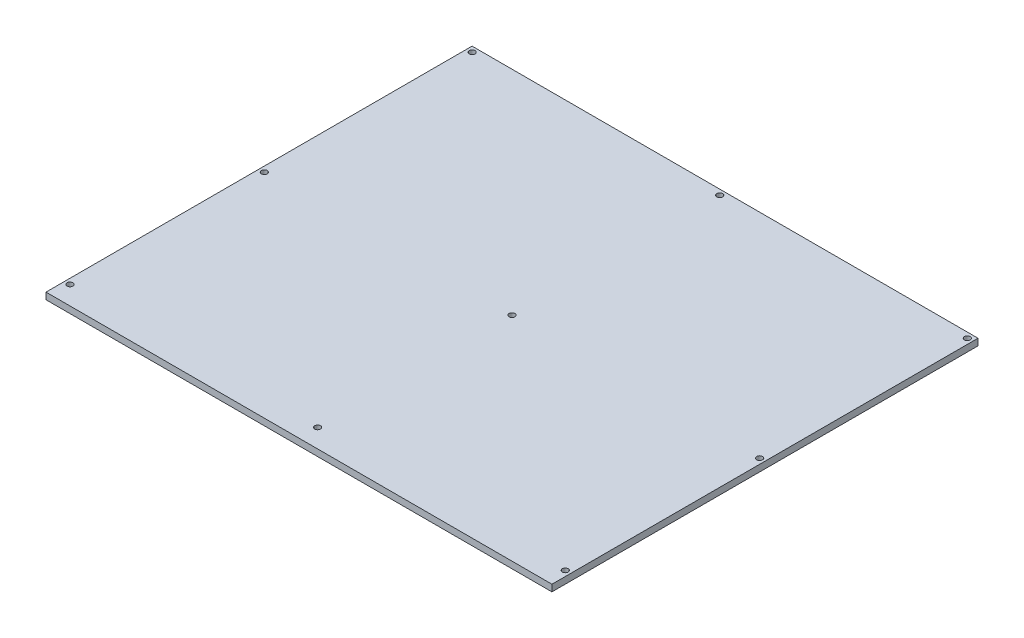
ISO-10303-21;
HEADER;
FILE_DESCRIPTION(('STEP AP214'),'2;1');
FILE_NAME('part.step','',(''),(''),'','','');
FILE_SCHEMA(('AUTOMOTIVE_DESIGN { 1 0 10303 214 1 1 1 1 }'));
ENDSEC;
DATA;
#1=APPLICATION_CONTEXT('core data for automotive mechanical design processes');
#2=APPLICATION_PROTOCOL_DEFINITION('international standard','automotive_design',2000,#1);
#3=PRODUCT_CONTEXT('',#1,'mechanical');
#4=PRODUCT('Part','Part','',(#3));
#5=PRODUCT_RELATED_PRODUCT_CATEGORY('part','',(#4));
#6=PRODUCT_DEFINITION_FORMATION('','',#4);
#7=PRODUCT_DEFINITION_CONTEXT('part definition',#1,'design');
#8=PRODUCT_DEFINITION('design','',#6,#7);
#9=PRODUCT_DEFINITION_SHAPE('','',#8);
#10=(LENGTH_UNIT() NAMED_UNIT(*) SI_UNIT(.MILLI.,.METRE.));
#11=(NAMED_UNIT(*) PLANE_ANGLE_UNIT() SI_UNIT($,.RADIAN.));
#12=(NAMED_UNIT(*) SI_UNIT($,.STERADIAN.) SOLID_ANGLE_UNIT());
#13=UNCERTAINTY_MEASURE_WITH_UNIT(LENGTH_MEASURE(1.E-05),#10,'distance_accuracy_value','');
#14=(GEOMETRIC_REPRESENTATION_CONTEXT(3) GLOBAL_UNCERTAINTY_ASSIGNED_CONTEXT((#13)) GLOBAL_UNIT_ASSIGNED_CONTEXT((#10,
#11,#12)) REPRESENTATION_CONTEXT('',''));
#15=CARTESIAN_POINT('',(0.,0.,0.));
#16=DIRECTION('',(0.,0.,1.));
#17=DIRECTION('',(1.,0.,0.));
#18=AXIS2_PLACEMENT_3D('',#15,#16,#17);
#19=CARTESIAN_POINT('',(0.,5.,0.));
#20=DIRECTION('',(1.,0.,0.));
#21=DIRECTION('',(0.,0.,-1.));
#22=AXIS2_PLACEMENT_3D('',#19,#20,#21);
#23=PLANE('',#22);
#24=DIRECTION('',(0.,0.,1.));
#25=VECTOR('',#24,1.);
#26=CARTESIAN_POINT('',(0.,0.,0.));
#27=LINE('',#26,#25);
#28=CARTESIAN_POINT('',(0.,0.,-320.));
#29=VERTEX_POINT('',#28);
#30=CARTESIAN_POINT('',(0.,0.,0.));
#31=VERTEX_POINT('',#30);
#32=EDGE_CURVE('E96',#29,#31,#27,.T.);
#33=ORIENTED_EDGE('',*,*,#32,.T.);
#34=DIRECTION('',(0.,-1.,0.));
#35=VECTOR('',#34,1.);
#36=CARTESIAN_POINT('',(0.,5.,0.));
#37=LINE('',#36,#35);
#38=CARTESIAN_POINT('',(0.,5.,0.));
#39=VERTEX_POINT('',#38);
#40=EDGE_CURVE('E11',#39,#31,#37,.T.);
#41=ORIENTED_EDGE('',*,*,#40,.F.);
#42=DIRECTION('',(0.,0.,1.));
#43=VECTOR('',#42,1.);
#44=CARTESIAN_POINT('',(0.,5.,0.));
#45=LINE('',#44,#43);
#46=CARTESIAN_POINT('',(0.,5.,-320.));
#47=VERTEX_POINT('',#46);
#48=EDGE_CURVE('E84',#47,#39,#45,.T.);
#49=ORIENTED_EDGE('',*,*,#48,.F.);
#50=DIRECTION('',(0.,-1.,0.));
#51=VECTOR('',#50,1.);
#52=CARTESIAN_POINT('',(0.,5.,-320.));
#53=LINE('',#52,#51);
#54=EDGE_CURVE('E92',#47,#29,#53,.T.);
#55=ORIENTED_EDGE('',*,*,#54,.T.);
#56=EDGE_LOOP('',(#33,#41,#49,#55));
#57=FACE_BOUND('',#56,.T.);
#58=ADVANCED_FACE('F33',(#57),#23,.F.);
#59=CARTESIAN_POINT('',(0.,5.,0.));
#60=DIRECTION('',(0.,0.,-1.));
#61=DIRECTION('',(-1.,0.,0.));
#62=AXIS2_PLACEMENT_3D('',#59,#60,#61);
#63=PLANE('',#62);
#64=DIRECTION('',(1.,0.,0.));
#65=VECTOR('',#64,1.);
#66=CARTESIAN_POINT('',(0.,0.,0.));
#67=LINE('',#66,#65);
#68=CARTESIAN_POINT('',(380.,0.,0.));
#69=VERTEX_POINT('',#68);
#70=EDGE_CURVE('E88',#31,#69,#67,.T.);
#71=ORIENTED_EDGE('',*,*,#70,.T.);
#72=DIRECTION('',(0.,-1.,0.));
#73=VECTOR('',#72,1.);
#74=CARTESIAN_POINT('',(380.,5.,0.));
#75=LINE('',#74,#73);
#76=CARTESIAN_POINT('',(380.,5.,0.));
#77=VERTEX_POINT('',#76);
#78=EDGE_CURVE('E41',#77,#69,#75,.T.);
#79=ORIENTED_EDGE('',*,*,#78,.F.);
#80=DIRECTION('',(1.,0.,0.));
#81=VECTOR('',#80,1.);
#82=CARTESIAN_POINT('',(0.,5.,0.));
#83=LINE('',#82,#81);
#84=EDGE_CURVE('E79',#39,#77,#83,.T.);
#85=ORIENTED_EDGE('',*,*,#84,.F.);
#86=ORIENTED_EDGE('',*,*,#40,.T.);
#87=EDGE_LOOP('',(#71,#79,#85,#86));
#88=FACE_BOUND('',#87,.T.);
#89=ADVANCED_FACE('F87',(#88),#63,.F.);
#90=CARTESIAN_POINT('',(380.,5.,0.));
#91=DIRECTION('',(-1.,0.,0.));
#92=DIRECTION('',(0.,0.,1.));
#93=AXIS2_PLACEMENT_3D('',#90,#91,#92);
#94=PLANE('',#93);
#95=DIRECTION('',(0.,0.,-1.));
#96=VECTOR('',#95,1.);
#97=CARTESIAN_POINT('',(380.,0.,0.));
#98=LINE('',#97,#96);
#99=CARTESIAN_POINT('',(380.,0.,-320.));
#100=VERTEX_POINT('',#99);
#101=EDGE_CURVE('E66',#69,#100,#98,.T.);
#102=ORIENTED_EDGE('',*,*,#101,.T.);
#103=DIRECTION('',(0.,-1.,0.));
#104=VECTOR('',#103,1.);
#105=CARTESIAN_POINT('',(380.,5.,-320.));
#106=LINE('',#105,#104);
#107=CARTESIAN_POINT('',(380.,5.,-320.));
#108=VERTEX_POINT('',#107);
#109=EDGE_CURVE('E89',#108,#100,#106,.T.);
#110=ORIENTED_EDGE('',*,*,#109,.F.);
#111=DIRECTION('',(0.,0.,-1.));
#112=VECTOR('',#111,1.);
#113=CARTESIAN_POINT('',(380.,5.,0.));
#114=LINE('',#113,#112);
#115=EDGE_CURVE('E82',#77,#108,#114,.T.);
#116=ORIENTED_EDGE('',*,*,#115,.F.);
#117=ORIENTED_EDGE('',*,*,#78,.T.);
#118=EDGE_LOOP('',(#102,#110,#116,#117));
#119=FACE_BOUND('',#118,.T.);
#120=ADVANCED_FACE('F90',(#119),#94,.F.);
#121=CARTESIAN_POINT('',(0.,5.,-320.));
#122=DIRECTION('',(0.,0.,1.));
#123=DIRECTION('',(1.,0.,0.));
#124=AXIS2_PLACEMENT_3D('',#121,#122,#123);
#125=PLANE('',#124);
#126=DIRECTION('',(-1.,0.,0.));
#127=VECTOR('',#126,1.);
#128=CARTESIAN_POINT('',(0.,0.,-320.));
#129=LINE('',#128,#127);
#130=EDGE_CURVE('E72',#100,#29,#129,.T.);
#131=ORIENTED_EDGE('',*,*,#130,.T.);
#132=ORIENTED_EDGE('',*,*,#54,.F.);
#133=DIRECTION('',(-1.,0.,0.));
#134=VECTOR('',#133,1.);
#135=CARTESIAN_POINT('',(0.,5.,-320.));
#136=LINE('',#135,#134);
#137=EDGE_CURVE('E49',#108,#47,#136,.T.);
#138=ORIENTED_EDGE('',*,*,#137,.F.);
#139=ORIENTED_EDGE('',*,*,#109,.T.);
#140=EDGE_LOOP('',(#131,#132,#138,#139));
#141=FACE_BOUND('',#140,.T.);
#142=ADVANCED_FACE('F104',(#141),#125,.F.);
#143=CARTESIAN_POINT('',(0.,5.,0.));
#144=DIRECTION('',(0.,-1.,0.));
#145=DIRECTION('',(0.,0.,-1.));
#146=AXIS2_PLACEMENT_3D('',#143,#144,#145);
#147=PLANE('',#146);
#148=CARTESIAN_POINT('',(4.,5.,-160.));
#149=DIRECTION('',(0.,1.,0.));
#150=DIRECTION('',(0.,0.,1.));
#151=AXIS2_PLACEMENT_3D('',#148,#149,#150);
#152=CIRCLE('',#151,2.20000000000001);
#153=CARTESIAN_POINT('',(4.,5.,-157.8));
#154=VERTEX_POINT('',#153);
#155=EDGE_CURVE('E135',#154,#154,#152,.T.);
#156=ORIENTED_EDGE('',*,*,#155,.F.);
#157=EDGE_LOOP('',(#156));
#158=FACE_BOUND('',#157,.T.);
#159=CARTESIAN_POINT('',(4.,5.,-14.));
#160=DIRECTION('',(0.,1.,0.));
#161=DIRECTION('',(0.,0.,1.));
#162=AXIS2_PLACEMENT_3D('',#159,#160,#161);
#163=CIRCLE('',#162,2.2);
#164=CARTESIAN_POINT('',(4.,5.,-11.8));
#165=VERTEX_POINT('',#164);
#166=EDGE_CURVE('E129',#165,#165,#163,.T.);
#167=ORIENTED_EDGE('',*,*,#166,.F.);
#168=EDGE_LOOP('',(#167));
#169=FACE_BOUND('',#168,.T.);
#170=CARTESIAN_POINT('',(190.,5.,-160.));
#171=DIRECTION('',(0.,1.,0.));
#172=DIRECTION('',(0.,0.,1.));
#173=AXIS2_PLACEMENT_3D('',#170,#171,#172);
#174=CIRCLE('',#173,2.20000000000001);
#175=CARTESIAN_POINT('',(190.,5.,-157.8));
#176=VERTEX_POINT('',#175);
#177=EDGE_CURVE('E123',#176,#176,#174,.T.);
#178=ORIENTED_EDGE('',*,*,#177,.F.);
#179=EDGE_LOOP('',(#178));
#180=FACE_BOUND('',#179,.T.);
#181=CARTESIAN_POINT('',(376.,5.,-160.));
#182=DIRECTION('',(0.,1.,0.));
#183=DIRECTION('',(0.,0.,-1.));
#184=AXIS2_PLACEMENT_3D('',#181,#182,#183);
#185=CIRCLE('',#184,2.20000000000004);
#186=CARTESIAN_POINT('',(376.,5.,-162.2));
#187=VERTEX_POINT('',#186);
#188=EDGE_CURVE('E116',#187,#187,#185,.T.);
#189=ORIENTED_EDGE('',*,*,#188,.F.);
#190=EDGE_LOOP('',(#189));
#191=FACE_BOUND('',#190,.T.);
#192=CARTESIAN_POINT('',(376.,5.,-14.));
#193=DIRECTION('',(0.,1.,0.));
#194=DIRECTION('',(0.,0.,-1.));
#195=AXIS2_PLACEMENT_3D('',#192,#193,#194);
#196=CIRCLE('',#195,2.20000000000004);
#197=CARTESIAN_POINT('',(376.,5.,-16.2));
#198=VERTEX_POINT('',#197);
#199=EDGE_CURVE('E158',#198,#198,#196,.T.);
#200=ORIENTED_EDGE('',*,*,#199,.F.);
#201=EDGE_LOOP('',(#200));
#202=FACE_BOUND('',#201,.T.);
#203=CARTESIAN_POINT('',(376.,5.,-316.));
#204=DIRECTION('',(0.,1.,0.));
#205=DIRECTION('',(0.,0.,-1.));
#206=AXIS2_PLACEMENT_3D('',#203,#204,#205);
#207=CIRCLE('',#206,2.19999999999998);
#208=CARTESIAN_POINT('',(376.,5.,-318.2));
#209=VERTEX_POINT('',#208);
#210=EDGE_CURVE('E152',#209,#209,#207,.T.);
#211=ORIENTED_EDGE('',*,*,#210,.F.);
#212=EDGE_LOOP('',(#211));
#213=FACE_BOUND('',#212,.T.);
#214=CARTESIAN_POINT('',(190.,5.,-316.));
#215=DIRECTION('',(0.,1.,0.));
#216=DIRECTION('',(0.,0.,1.));
#217=AXIS2_PLACEMENT_3D('',#214,#215,#216);
#218=CIRCLE('',#217,2.20000000000001);
#219=CARTESIAN_POINT('',(190.,5.,-313.8));
#220=VERTEX_POINT('',#219);
#221=EDGE_CURVE('E146',#220,#220,#218,.T.);
#222=ORIENTED_EDGE('',*,*,#221,.F.);
#223=EDGE_LOOP('',(#222));
#224=FACE_BOUND('',#223,.T.);
#225=CARTESIAN_POINT('',(190.,5.,-14.));
#226=DIRECTION('',(0.,1.,0.));
#227=DIRECTION('',(0.,0.,1.));
#228=AXIS2_PLACEMENT_3D('',#225,#226,#227);
#229=CIRCLE('',#228,2.20000000000001);
#230=CARTESIAN_POINT('',(190.,5.,-11.8));
#231=VERTEX_POINT('',#230);
#232=EDGE_CURVE('E140',#231,#231,#229,.T.);
#233=ORIENTED_EDGE('',*,*,#232,.F.);
#234=EDGE_LOOP('',(#233));
#235=FACE_BOUND('',#234,.T.);
#236=CARTESIAN_POINT('',(4.,5.,-316.));
#237=DIRECTION('',(0.,1.,0.));
#238=DIRECTION('',(0.,0.,1.));
#239=AXIS2_PLACEMENT_3D('',#236,#237,#238);
#240=CIRCLE('',#239,2.19999999999998);
#241=CARTESIAN_POINT('',(4.,5.,-313.8));
#242=VERTEX_POINT('',#241);
#243=EDGE_CURVE('E110',#242,#242,#240,.T.);
#244=ORIENTED_EDGE('',*,*,#243,.F.);
#245=EDGE_LOOP('',(#244));
#246=FACE_BOUND('',#245,.T.);
#247=ORIENTED_EDGE('',*,*,#48,.T.);
#248=ORIENTED_EDGE('',*,*,#84,.T.);
#249=ORIENTED_EDGE('',*,*,#115,.T.);
#250=ORIENTED_EDGE('',*,*,#137,.T.);
#251=EDGE_LOOP('',(#247,#248,#249,#250));
#252=FACE_BOUND('',#251,.T.);
#253=ADVANCED_FACE('F80',(#158,#169,#180,#191,#202,#213,#224,#235,#246,#252),#147,.F.);
#254=CARTESIAN_POINT('',(0.,0.,0.));
#255=DIRECTION('',(0.,-1.,0.));
#256=DIRECTION('',(0.,0.,-1.));
#257=AXIS2_PLACEMENT_3D('',#254,#255,#256);
#258=PLANE('',#257);
#259=CARTESIAN_POINT('',(4.,0.,-160.));
#260=DIRECTION('',(0.,1.,0.));
#261=DIRECTION('',(0.,0.,1.));
#262=AXIS2_PLACEMENT_3D('',#259,#260,#261);
#263=CIRCLE('',#262,2.20000000000001);
#264=CARTESIAN_POINT('',(4.,0.,-157.8));
#265=VERTEX_POINT('',#264);
#266=EDGE_CURVE('E113',#265,#265,#263,.T.);
#267=ORIENTED_EDGE('',*,*,#266,.T.);
#268=EDGE_LOOP('',(#267));
#269=FACE_BOUND('',#268,.T.);
#270=CARTESIAN_POINT('',(4.,0.,-14.));
#271=DIRECTION('',(0.,1.,0.));
#272=DIRECTION('',(0.,0.,1.));
#273=AXIS2_PLACEMENT_3D('',#270,#271,#272);
#274=CIRCLE('',#273,2.2);
#275=CARTESIAN_POINT('',(4.,0.,-11.8));
#276=VERTEX_POINT('',#275);
#277=EDGE_CURVE('E132',#276,#276,#274,.T.);
#278=ORIENTED_EDGE('',*,*,#277,.T.);
#279=EDGE_LOOP('',(#278));
#280=FACE_BOUND('',#279,.T.);
#281=CARTESIAN_POINT('',(190.,0.,-160.));
#282=DIRECTION('',(0.,1.,0.));
#283=DIRECTION('',(0.,0.,1.));
#284=AXIS2_PLACEMENT_3D('',#281,#282,#283);
#285=CIRCLE('',#284,2.20000000000001);
#286=CARTESIAN_POINT('',(190.,0.,-157.8));
#287=VERTEX_POINT('',#286);
#288=EDGE_CURVE('E126',#287,#287,#285,.T.);
#289=ORIENTED_EDGE('',*,*,#288,.T.);
#290=EDGE_LOOP('',(#289));
#291=FACE_BOUND('',#290,.T.);
#292=CARTESIAN_POINT('',(376.,0.,-160.));
#293=DIRECTION('',(0.,1.,0.));
#294=DIRECTION('',(0.,0.,-1.));
#295=AXIS2_PLACEMENT_3D('',#292,#293,#294);
#296=CIRCLE('',#295,2.20000000000004);
#297=CARTESIAN_POINT('',(376.,0.,-162.2));
#298=VERTEX_POINT('',#297);
#299=EDGE_CURVE('E119',#298,#298,#296,.T.);
#300=ORIENTED_EDGE('',*,*,#299,.T.);
#301=EDGE_LOOP('',(#300));
#302=FACE_BOUND('',#301,.T.);
#303=CARTESIAN_POINT('',(376.,0.,-14.));
#304=DIRECTION('',(0.,1.,0.));
#305=DIRECTION('',(0.,0.,-1.));
#306=AXIS2_PLACEMENT_3D('',#303,#304,#305);
#307=CIRCLE('',#306,2.20000000000004);
#308=CARTESIAN_POINT('',(376.,0.,-16.2));
#309=VERTEX_POINT('',#308);
#310=EDGE_CURVE('E120',#309,#309,#307,.T.);
#311=ORIENTED_EDGE('',*,*,#310,.T.);
#312=EDGE_LOOP('',(#311));
#313=FACE_BOUND('',#312,.T.);
#314=CARTESIAN_POINT('',(376.,0.,-316.));
#315=DIRECTION('',(0.,1.,0.));
#316=DIRECTION('',(0.,0.,-1.));
#317=AXIS2_PLACEMENT_3D('',#314,#315,#316);
#318=CIRCLE('',#317,2.19999999999998);
#319=CARTESIAN_POINT('',(376.,0.,-318.2));
#320=VERTEX_POINT('',#319);
#321=EDGE_CURVE('E155',#320,#320,#318,.T.);
#322=ORIENTED_EDGE('',*,*,#321,.T.);
#323=EDGE_LOOP('',(#322));
#324=FACE_BOUND('',#323,.T.);
#325=CARTESIAN_POINT('',(190.,0.,-316.));
#326=DIRECTION('',(0.,1.,0.));
#327=DIRECTION('',(0.,0.,1.));
#328=AXIS2_PLACEMENT_3D('',#325,#326,#327);
#329=CIRCLE('',#328,2.20000000000001);
#330=CARTESIAN_POINT('',(190.,0.,-313.8));
#331=VERTEX_POINT('',#330);
#332=EDGE_CURVE('E149',#331,#331,#329,.T.);
#333=ORIENTED_EDGE('',*,*,#332,.T.);
#334=EDGE_LOOP('',(#333));
#335=FACE_BOUND('',#334,.T.);
#336=CARTESIAN_POINT('',(190.,0.,-14.));
#337=DIRECTION('',(0.,1.,0.));
#338=DIRECTION('',(0.,0.,1.));
#339=AXIS2_PLACEMENT_3D('',#336,#337,#338);
#340=CIRCLE('',#339,2.20000000000001);
#341=CARTESIAN_POINT('',(190.,0.,-11.8));
#342=VERTEX_POINT('',#341);
#343=EDGE_CURVE('E143',#342,#342,#340,.T.);
#344=ORIENTED_EDGE('',*,*,#343,.T.);
#345=EDGE_LOOP('',(#344));
#346=FACE_BOUND('',#345,.T.);
#347=CARTESIAN_POINT('',(4.,0.,-316.));
#348=DIRECTION('',(0.,1.,0.));
#349=DIRECTION('',(0.,0.,1.));
#350=AXIS2_PLACEMENT_3D('',#347,#348,#349);
#351=CIRCLE('',#350,2.19999999999998);
#352=CARTESIAN_POINT('',(4.,0.,-313.8));
#353=VERTEX_POINT('',#352);
#354=EDGE_CURVE('E99',#353,#353,#351,.T.);
#355=ORIENTED_EDGE('',*,*,#354,.T.);
#356=EDGE_LOOP('',(#355));
#357=FACE_BOUND('',#356,.T.);
#358=ORIENTED_EDGE('',*,*,#32,.F.);
#359=ORIENTED_EDGE('',*,*,#130,.F.);
#360=ORIENTED_EDGE('',*,*,#101,.F.);
#361=ORIENTED_EDGE('',*,*,#70,.F.);
#362=EDGE_LOOP('',(#358,#359,#360,#361));
#363=FACE_BOUND('',#362,.T.);
#364=ADVANCED_FACE('F107',(#269,#280,#291,#302,#313,#324,#335,#346,#357,#363),#258,.T.);
#365=CARTESIAN_POINT('',(4.,0.,-316.));
#366=DIRECTION('',(0.,1.,0.));
#367=DIRECTION('',(0.,0.,1.));
#368=AXIS2_PLACEMENT_3D('',#365,#366,#367);
#369=CYLINDRICAL_SURFACE('',#368,2.19999999999998);
#370=ORIENTED_EDGE('',*,*,#354,.F.);
#371=EDGE_LOOP('',(#370));
#372=FACE_BOUND('',#371,.T.);
#373=ORIENTED_EDGE('',*,*,#243,.T.);
#374=EDGE_LOOP('',(#373));
#375=FACE_BOUND('',#374,.T.);
#376=ADVANCED_FACE('F186',(#372,#375),#369,.F.);
#377=CARTESIAN_POINT('',(190.,0.,-14.));
#378=DIRECTION('',(0.,1.,0.));
#379=DIRECTION('',(0.,0.,1.));
#380=AXIS2_PLACEMENT_3D('',#377,#378,#379);
#381=CYLINDRICAL_SURFACE('',#380,2.20000000000001);
#382=ORIENTED_EDGE('',*,*,#343,.F.);
#383=EDGE_LOOP('',(#382));
#384=FACE_BOUND('',#383,.T.);
#385=ORIENTED_EDGE('',*,*,#232,.T.);
#386=EDGE_LOOP('',(#385));
#387=FACE_BOUND('',#386,.T.);
#388=ADVANCED_FACE('F188',(#384,#387),#381,.F.);
#389=CARTESIAN_POINT('',(190.,0.,-316.));
#390=DIRECTION('',(0.,1.,0.));
#391=DIRECTION('',(0.,0.,1.));
#392=AXIS2_PLACEMENT_3D('',#389,#390,#391);
#393=CYLINDRICAL_SURFACE('',#392,2.20000000000001);
#394=ORIENTED_EDGE('',*,*,#332,.F.);
#395=EDGE_LOOP('',(#394));
#396=FACE_BOUND('',#395,.T.);
#397=ORIENTED_EDGE('',*,*,#221,.T.);
#398=EDGE_LOOP('',(#397));
#399=FACE_BOUND('',#398,.T.);
#400=ADVANCED_FACE('F195',(#396,#399),#393,.F.);
#401=CARTESIAN_POINT('',(376.,0.,-316.));
#402=DIRECTION('',(0.,1.,0.));
#403=DIRECTION('',(0.,0.,1.));
#404=AXIS2_PLACEMENT_3D('',#401,#402,#403);
#405=CYLINDRICAL_SURFACE('',#404,2.19999999999998);
#406=ORIENTED_EDGE('',*,*,#321,.F.);
#407=EDGE_LOOP('',(#406));
#408=FACE_BOUND('',#407,.T.);
#409=ORIENTED_EDGE('',*,*,#210,.T.);
#410=EDGE_LOOP('',(#409));
#411=FACE_BOUND('',#410,.T.);
#412=ADVANCED_FACE('F170',(#408,#411),#405,.F.);
#413=CARTESIAN_POINT('',(376.,0.,-14.));
#414=DIRECTION('',(0.,1.,0.));
#415=DIRECTION('',(0.,0.,1.));
#416=AXIS2_PLACEMENT_3D('',#413,#414,#415);
#417=CYLINDRICAL_SURFACE('',#416,2.20000000000004);
#418=ORIENTED_EDGE('',*,*,#310,.F.);
#419=EDGE_LOOP('',(#418));
#420=FACE_BOUND('',#419,.T.);
#421=ORIENTED_EDGE('',*,*,#199,.T.);
#422=EDGE_LOOP('',(#421));
#423=FACE_BOUND('',#422,.T.);
#424=ADVANCED_FACE('F166',(#420,#423),#417,.F.);
#425=CARTESIAN_POINT('',(376.,0.,-160.));
#426=DIRECTION('',(0.,1.,0.));
#427=DIRECTION('',(0.,0.,1.));
#428=AXIS2_PLACEMENT_3D('',#425,#426,#427);
#429=CYLINDRICAL_SURFACE('',#428,2.20000000000004);
#430=ORIENTED_EDGE('',*,*,#299,.F.);
#431=EDGE_LOOP('',(#430));
#432=FACE_BOUND('',#431,.T.);
#433=ORIENTED_EDGE('',*,*,#188,.T.);
#434=EDGE_LOOP('',(#433));
#435=FACE_BOUND('',#434,.T.);
#436=ADVANCED_FACE('F169',(#432,#435),#429,.F.);
#437=CARTESIAN_POINT('',(190.,0.,-160.));
#438=DIRECTION('',(0.,1.,0.));
#439=DIRECTION('',(0.,0.,1.));
#440=AXIS2_PLACEMENT_3D('',#437,#438,#439);
#441=CYLINDRICAL_SURFACE('',#440,2.20000000000001);
#442=ORIENTED_EDGE('',*,*,#288,.F.);
#443=EDGE_LOOP('',(#442));
#444=FACE_BOUND('',#443,.T.);
#445=ORIENTED_EDGE('',*,*,#177,.T.);
#446=EDGE_LOOP('',(#445));
#447=FACE_BOUND('',#446,.T.);
#448=ADVANCED_FACE('F267',(#444,#447),#441,.F.);
#449=CARTESIAN_POINT('',(4.,0.,-14.));
#450=DIRECTION('',(0.,1.,0.));
#451=DIRECTION('',(0.,0.,1.));
#452=AXIS2_PLACEMENT_3D('',#449,#450,#451);
#453=CYLINDRICAL_SURFACE('',#452,2.2);
#454=ORIENTED_EDGE('',*,*,#277,.F.);
#455=EDGE_LOOP('',(#454));
#456=FACE_BOUND('',#455,.T.);
#457=ORIENTED_EDGE('',*,*,#166,.T.);
#458=EDGE_LOOP('',(#457));
#459=FACE_BOUND('',#458,.T.);
#460=ADVANCED_FACE('F276',(#456,#459),#453,.F.);
#461=CARTESIAN_POINT('',(4.,0.,-160.));
#462=DIRECTION('',(0.,1.,0.));
#463=DIRECTION('',(0.,0.,1.));
#464=AXIS2_PLACEMENT_3D('',#461,#462,#463);
#465=CYLINDRICAL_SURFACE('',#464,2.20000000000001);
#466=ORIENTED_EDGE('',*,*,#266,.F.);
#467=EDGE_LOOP('',(#466));
#468=FACE_BOUND('',#467,.T.);
#469=ORIENTED_EDGE('',*,*,#155,.T.);
#470=EDGE_LOOP('',(#469));
#471=FACE_BOUND('',#470,.T.);
#472=ADVANCED_FACE('F286',(#468,#471),#465,.F.);
#473=CLOSED_SHELL('',(#58,#89,#120,#142,#253,#364,#376,#388,#400,#412,#424,#436,#448,#460,#472));
#474=MANIFOLD_SOLID_BREP('B2',#473);
#475=ADVANCED_BREP_SHAPE_REPRESENTATION('',(#18,#474),#14);
#476=SHAPE_DEFINITION_REPRESENTATION(#9,#475);
ENDSEC;
END-ISO-10303-21;
